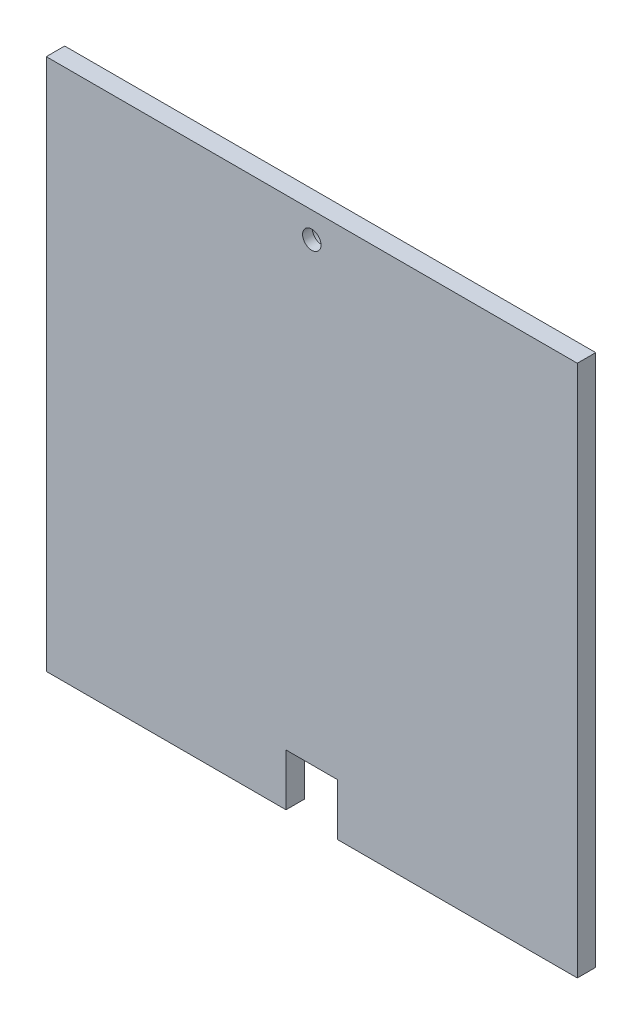
ISO-10303-21;
HEADER;
FILE_DESCRIPTION(('STEP AP214'),'2;1');
FILE_NAME('part.step','',(''),(''),'','','');
FILE_SCHEMA(('AUTOMOTIVE_DESIGN { 1 0 10303 214 1 1 1 1 }'));
ENDSEC;
DATA;
#1=APPLICATION_CONTEXT('core data for automotive mechanical design processes');
#2=APPLICATION_PROTOCOL_DEFINITION('international standard','automotive_design',2000,#1);
#3=PRODUCT_CONTEXT('',#1,'mechanical');
#4=PRODUCT('Part','Part','',(#3));
#5=PRODUCT_RELATED_PRODUCT_CATEGORY('part','',(#4));
#6=PRODUCT_DEFINITION_FORMATION('','',#4);
#7=PRODUCT_DEFINITION_CONTEXT('part definition',#1,'design');
#8=PRODUCT_DEFINITION('design','',#6,#7);
#9=PRODUCT_DEFINITION_SHAPE('','',#8);
#10=(LENGTH_UNIT() NAMED_UNIT(*) SI_UNIT(.MILLI.,.METRE.));
#11=(NAMED_UNIT(*) PLANE_ANGLE_UNIT() SI_UNIT($,.RADIAN.));
#12=(NAMED_UNIT(*) SI_UNIT($,.STERADIAN.) SOLID_ANGLE_UNIT());
#13=UNCERTAINTY_MEASURE_WITH_UNIT(LENGTH_MEASURE(1.E-05),#10,'distance_accuracy_value','');
#14=(GEOMETRIC_REPRESENTATION_CONTEXT(3) GLOBAL_UNCERTAINTY_ASSIGNED_CONTEXT((#13)) GLOBAL_UNIT_ASSIGNED_CONTEXT((#10,
#11,#12)) REPRESENTATION_CONTEXT('',''));
#15=CARTESIAN_POINT('',(0.,0.,0.));
#16=DIRECTION('',(0.,0.,1.));
#17=DIRECTION('',(1.,0.,0.));
#18=AXIS2_PLACEMENT_3D('',#15,#16,#17);
#19=CARTESIAN_POINT('',(-268.431690787297,-820.,15.));
#20=DIRECTION('',(0.,1.,0.));
#21=DIRECTION('',(-1.,0.,0.));
#22=AXIS2_PLACEMENT_3D('',#19,#20,#21);
#23=PLANE('',#22);
#24=DIRECTION('',(1.,0.,0.));
#25=VECTOR('',#24,1.);
#26=CARTESIAN_POINT('',(-268.431690787297,-820.,15.));
#27=LINE('',#26,#25);
#28=CARTESIAN_POINT('',(-31.1990310228092,-820.,15.));
#29=VERTEX_POINT('',#28);
#30=CARTESIAN_POINT('',(164.033628741678,-820.,15.));
#31=VERTEX_POINT('',#30);
#32=EDGE_CURVE('E150',#29,#31,#27,.T.);
#33=ORIENTED_EDGE('',*,*,#32,.F.);
#34=DIRECTION('',(0.,0.,-1.));
#35=VECTOR('',#34,1.);
#36=CARTESIAN_POINT('',(-31.1990310228092,-820.,15.));
#37=LINE('',#36,#35);
#38=CARTESIAN_POINT('',(-31.1990310228092,-820.,0.));
#39=VERTEX_POINT('',#38);
#40=EDGE_CURVE('E11',#29,#39,#37,.T.);
#41=ORIENTED_EDGE('',*,*,#40,.T.);
#42=DIRECTION('',(1.,0.,0.));
#43=VECTOR('',#42,1.);
#44=CARTESIAN_POINT('',(-268.431690787297,-820.,0.));
#45=LINE('',#44,#43);
#46=CARTESIAN_POINT('',(164.033628741678,-820.,0.));
#47=VERTEX_POINT('',#46);
#48=EDGE_CURVE('E145',#39,#47,#45,.T.);
#49=ORIENTED_EDGE('',*,*,#48,.T.);
#50=DIRECTION('',(0.,0.,1.));
#51=VECTOR('',#50,1.);
#52=CARTESIAN_POINT('',(164.033628741678,-820.,15.));
#53=LINE('',#52,#51);
#54=EDGE_CURVE('E140',#47,#31,#53,.T.);
#55=ORIENTED_EDGE('',*,*,#54,.T.);
#56=EDGE_LOOP('',(#33,#41,#49,#55));
#57=FACE_BOUND('',#56,.T.);
#58=ADVANCED_FACE('F37',(#57),#23,.F.);
#59=CARTESIAN_POINT('',(-268.431690787297,0.,15.));
#60=DIRECTION('',(1.,0.,0.));
#61=DIRECTION('',(0.,1.,0.));
#62=AXIS2_PLACEMENT_3D('',#59,#60,#61);
#63=PLANE('',#62);
#64=DIRECTION('',(0.,-1.,0.));
#65=VECTOR('',#64,1.);
#66=CARTESIAN_POINT('',(-268.431690787297,0.,15.));
#67=LINE('',#66,#65);
#68=CARTESIAN_POINT('',(-268.431690787297,-386.429556720008,15.));
#69=VERTEX_POINT('',#68);
#70=CARTESIAN_POINT('',(-268.431690787297,-820.,15.));
#71=VERTEX_POINT('',#70);
#72=EDGE_CURVE('E154',#69,#71,#67,.T.);
#73=ORIENTED_EDGE('',*,*,#72,.F.);
#74=DIRECTION('',(0.,0.,1.));
#75=VECTOR('',#74,1.);
#76=CARTESIAN_POINT('',(-268.431690787297,-386.429556720008,15.));
#77=LINE('',#76,#75);
#78=CARTESIAN_POINT('',(-268.431690787297,-386.429556720008,0.));
#79=VERTEX_POINT('',#78);
#80=EDGE_CURVE('E132',#79,#69,#77,.T.);
#81=ORIENTED_EDGE('',*,*,#80,.F.);
#82=DIRECTION('',(0.,-1.,0.));
#83=VECTOR('',#82,1.);
#84=CARTESIAN_POINT('',(-268.431690787297,0.,0.));
#85=LINE('',#84,#83);
#86=CARTESIAN_POINT('',(-268.431690787297,-820.,0.));
#87=VERTEX_POINT('',#86);
#88=EDGE_CURVE('E149',#79,#87,#85,.T.);
#89=ORIENTED_EDGE('',*,*,#88,.T.);
#90=DIRECTION('',(0.,0.,1.));
#91=VECTOR('',#90,1.);
#92=CARTESIAN_POINT('',(-268.431690787297,-820.,15.));
#93=LINE('',#92,#91);
#94=EDGE_CURVE('E142',#87,#71,#93,.T.);
#95=ORIENTED_EDGE('',*,*,#94,.T.);
#96=EDGE_LOOP('',(#73,#81,#89,#95));
#97=FACE_BOUND('',#96,.T.);
#98=ADVANCED_FACE('F39',(#97),#63,.F.);
#99=CARTESIAN_POINT('',(164.033628741678,0.,15.));
#100=DIRECTION('',(-1.,0.,0.));
#101=DIRECTION('',(0.,-1.,0.));
#102=AXIS2_PLACEMENT_3D('',#99,#100,#101);
#103=PLANE('',#102);
#104=DIRECTION('',(0.,1.,0.));
#105=VECTOR('',#104,1.);
#106=CARTESIAN_POINT('',(164.033628741678,0.,0.));
#107=LINE('',#106,#105);
#108=CARTESIAN_POINT('',(164.033628741678,-386.429556720008,0.));
#109=VERTEX_POINT('',#108);
#110=EDGE_CURVE('E157',#47,#109,#107,.T.);
#111=ORIENTED_EDGE('',*,*,#110,.T.);
#112=DIRECTION('',(0.,0.,1.));
#113=VECTOR('',#112,1.);
#114=CARTESIAN_POINT('',(164.033628741678,-386.429556720008,15.));
#115=LINE('',#114,#113);
#116=CARTESIAN_POINT('',(164.033628741678,-386.429556720008,15.));
#117=VERTEX_POINT('',#116);
#118=EDGE_CURVE('E60',#109,#117,#115,.T.);
#119=ORIENTED_EDGE('',*,*,#118,.T.);
#120=DIRECTION('',(0.,1.,0.));
#121=VECTOR('',#120,1.);
#122=CARTESIAN_POINT('',(164.033628741678,0.,15.));
#123=LINE('',#122,#121);
#124=EDGE_CURVE('E156',#31,#117,#123,.T.);
#125=ORIENTED_EDGE('',*,*,#124,.F.);
#126=ORIENTED_EDGE('',*,*,#54,.F.);
#127=EDGE_LOOP('',(#111,#119,#125,#126));
#128=FACE_BOUND('',#127,.T.);
#129=ADVANCED_FACE('F180',(#128),#103,.F.);
#130=CARTESIAN_POINT('',(0.,0.,15.));
#131=DIRECTION('',(0.,0.,-1.));
#132=DIRECTION('',(-1.,0.,0.));
#133=AXIS2_PLACEMENT_3D('',#130,#131,#132);
#134=PLANE('',#133);
#135=CARTESIAN_POINT('',(-52.1990310228091,-407.429556720008,15.));
#136=DIRECTION('',(0.,0.,-1.));
#137=DIRECTION('',(-1.,0.,0.));
#138=AXIS2_PLACEMENT_3D('',#135,#136,#137);
#139=CIRCLE('',#138,7.5);
#140=CARTESIAN_POINT('',(-59.6990310228091,-407.429556720008,15.));
#141=VERTEX_POINT('',#140);
#142=EDGE_CURVE('E209',#141,#141,#139,.T.);
#143=ORIENTED_EDGE('',*,*,#142,.T.);
#144=EDGE_LOOP('',(#143));
#145=FACE_BOUND('',#144,.T.);
#146=DIRECTION('',(1.,0.,0.));
#147=VECTOR('',#146,1.);
#148=CARTESIAN_POINT('',(-73.1990310228092,-777.772364763387,15.));
#149=LINE('',#148,#147);
#150=CARTESIAN_POINT('',(-73.1990310228092,-777.772364763387,15.));
#151=VERTEX_POINT('',#150);
#152=CARTESIAN_POINT('',(-31.1990310228092,-777.772364763387,15.));
#153=VERTEX_POINT('',#152);
#154=EDGE_CURVE('E109',#151,#153,#149,.T.);
#155=ORIENTED_EDGE('',*,*,#154,.T.);
#156=DIRECTION('',(0.,-1.,0.));
#157=VECTOR('',#156,1.);
#158=CARTESIAN_POINT('',(-31.1990310228092,-820.227635236613,15.));
#159=LINE('',#158,#157);
#160=EDGE_CURVE('E121',#153,#29,#159,.T.);
#161=ORIENTED_EDGE('',*,*,#160,.T.);
#162=ORIENTED_EDGE('',*,*,#32,.T.);
#163=ORIENTED_EDGE('',*,*,#124,.T.);
#164=DIRECTION('',(-1.,0.,0.));
#165=VECTOR('',#164,1.);
#166=CARTESIAN_POINT('',(164.033628741678,-386.429556720008,15.));
#167=LINE('',#166,#165);
#168=EDGE_CURVE('E137',#117,#69,#167,.T.);
#169=ORIENTED_EDGE('',*,*,#168,.T.);
#170=ORIENTED_EDGE('',*,*,#72,.T.);
#171=CARTESIAN_POINT('',(-73.1990310228092,-820.,15.));
#172=VERTEX_POINT('',#171);
#173=EDGE_CURVE('E120',#71,#172,#27,.T.);
#174=ORIENTED_EDGE('',*,*,#173,.T.);
#175=DIRECTION('',(0.,1.,0.));
#176=VECTOR('',#175,1.);
#177=CARTESIAN_POINT('',(-73.1990310228092,-820.227635236613,15.));
#178=LINE('',#177,#176);
#179=EDGE_CURVE('E52',#172,#151,#178,.T.);
#180=ORIENTED_EDGE('',*,*,#179,.T.);
#181=EDGE_LOOP('',(#155,#161,#162,#163,#169,#170,#174,#180));
#182=FACE_BOUND('',#181,.T.);
#183=ADVANCED_FACE('F118',(#145,#182),#134,.F.);
#184=CARTESIAN_POINT('',(0.,0.,0.));
#185=DIRECTION('',(0.,0.,-1.));
#186=DIRECTION('',(-1.,0.,0.));
#187=AXIS2_PLACEMENT_3D('',#184,#185,#186);
#188=PLANE('',#187);
#189=CARTESIAN_POINT('',(-52.1990310228091,-407.429556720008,0.));
#190=DIRECTION('',(0.,0.,-1.));
#191=DIRECTION('',(-1.,0.,0.));
#192=AXIS2_PLACEMENT_3D('',#189,#190,#191);
#193=CIRCLE('',#192,11.);
#194=CARTESIAN_POINT('',(-63.1990310228091,-407.429556720008,0.));
#195=VERTEX_POINT('',#194);
#196=EDGE_CURVE('E207',#195,#195,#193,.T.);
#197=ORIENTED_EDGE('',*,*,#196,.F.);
#198=EDGE_LOOP('',(#197));
#199=FACE_BOUND('',#198,.T.);
#200=DIRECTION('',(0.,-1.,0.));
#201=VECTOR('',#200,1.);
#202=CARTESIAN_POINT('',(-31.1990310228092,-820.227635236613,0.));
#203=LINE('',#202,#201);
#204=CARTESIAN_POINT('',(-31.1990310228092,-777.772364763387,0.));
#205=VERTEX_POINT('',#204);
#206=EDGE_CURVE('E127',#205,#39,#203,.T.);
#207=ORIENTED_EDGE('',*,*,#206,.F.);
#208=DIRECTION('',(1.,0.,0.));
#209=VECTOR('',#208,1.);
#210=CARTESIAN_POINT('',(-73.1990310228092,-777.772364763387,0.));
#211=LINE('',#210,#209);
#212=CARTESIAN_POINT('',(-73.1990310228092,-777.772364763387,0.));
#213=VERTEX_POINT('',#212);
#214=EDGE_CURVE('E123',#213,#205,#211,.T.);
#215=ORIENTED_EDGE('',*,*,#214,.F.);
#216=DIRECTION('',(0.,1.,0.));
#217=VECTOR('',#216,1.);
#218=CARTESIAN_POINT('',(-73.1990310228092,-820.227635236613,0.));
#219=LINE('',#218,#217);
#220=CARTESIAN_POINT('',(-73.1990310228092,-820.,0.));
#221=VERTEX_POINT('',#220);
#222=EDGE_CURVE('E104',#221,#213,#219,.T.);
#223=ORIENTED_EDGE('',*,*,#222,.F.);
#224=EDGE_CURVE('E151',#87,#221,#45,.T.);
#225=ORIENTED_EDGE('',*,*,#224,.F.);
#226=ORIENTED_EDGE('',*,*,#88,.F.);
#227=DIRECTION('',(-1.,0.,0.));
#228=VECTOR('',#227,1.);
#229=CARTESIAN_POINT('',(164.033628741678,-386.429556720008,0.));
#230=LINE('',#229,#228);
#231=EDGE_CURVE('E135',#109,#79,#230,.T.);
#232=ORIENTED_EDGE('',*,*,#231,.F.);
#233=ORIENTED_EDGE('',*,*,#110,.F.);
#234=ORIENTED_EDGE('',*,*,#48,.F.);
#235=EDGE_LOOP('',(#207,#215,#223,#225,#226,#232,#233,#234));
#236=FACE_BOUND('',#235,.T.);
#237=ADVANCED_FACE('F168',(#199,#236),#188,.T.);
#238=ORIENTED_EDGE('',*,*,#224,.T.);
#239=DIRECTION('',(0.,0.,1.));
#240=VECTOR('',#239,1.);
#241=CARTESIAN_POINT('',(-73.1990310228092,-820.,15.));
#242=LINE('',#241,#240);
#243=EDGE_CURVE('E45',#221,#172,#242,.T.);
#244=ORIENTED_EDGE('',*,*,#243,.T.);
#245=ORIENTED_EDGE('',*,*,#173,.F.);
#246=ORIENTED_EDGE('',*,*,#94,.F.);
#247=EDGE_LOOP('',(#238,#244,#245,#246));
#248=FACE_BOUND('',#247,.T.);
#249=ADVANCED_FACE('F163',(#248),#23,.F.);
#250=CARTESIAN_POINT('',(164.033628741678,-386.429556720008,15.));
#251=DIRECTION('',(0.,-1.,0.));
#252=DIRECTION('',(1.,0.,0.));
#253=AXIS2_PLACEMENT_3D('',#250,#251,#252);
#254=PLANE('',#253);
#255=ORIENTED_EDGE('',*,*,#80,.T.);
#256=ORIENTED_EDGE('',*,*,#168,.F.);
#257=ORIENTED_EDGE('',*,*,#118,.F.);
#258=ORIENTED_EDGE('',*,*,#231,.T.);
#259=EDGE_LOOP('',(#255,#256,#257,#258));
#260=FACE_BOUND('',#259,.T.);
#261=ADVANCED_FACE('F182',(#260),#254,.F.);
#262=CARTESIAN_POINT('',(-31.1990310228092,-820.227635236613,15.));
#263=DIRECTION('',(1.,0.,0.));
#264=DIRECTION('',(0.,0.,-1.));
#265=AXIS2_PLACEMENT_3D('',#262,#263,#264);
#266=PLANE('',#265);
#267=ORIENTED_EDGE('',*,*,#160,.F.);
#268=DIRECTION('',(0.,0.,-1.));
#269=VECTOR('',#268,1.);
#270=CARTESIAN_POINT('',(-31.1990310228092,-777.772364763387,15.));
#271=LINE('',#270,#269);
#272=EDGE_CURVE('E108',#153,#205,#271,.T.);
#273=ORIENTED_EDGE('',*,*,#272,.T.);
#274=ORIENTED_EDGE('',*,*,#206,.T.);
#275=ORIENTED_EDGE('',*,*,#40,.F.);
#276=EDGE_LOOP('',(#267,#273,#274,#275));
#277=FACE_BOUND('',#276,.T.);
#278=ADVANCED_FACE('F173',(#277),#266,.F.);
#279=CARTESIAN_POINT('',(-73.1990310228092,-820.227635236613,15.));
#280=DIRECTION('',(-1.,0.,0.));
#281=DIRECTION('',(0.,0.,1.));
#282=AXIS2_PLACEMENT_3D('',#279,#280,#281);
#283=PLANE('',#282);
#284=ORIENTED_EDGE('',*,*,#222,.T.);
#285=DIRECTION('',(0.,0.,-1.));
#286=VECTOR('',#285,1.);
#287=CARTESIAN_POINT('',(-73.1990310228092,-777.772364763387,15.));
#288=LINE('',#287,#286);
#289=EDGE_CURVE('E100',#151,#213,#288,.T.);
#290=ORIENTED_EDGE('',*,*,#289,.F.);
#291=ORIENTED_EDGE('',*,*,#179,.F.);
#292=ORIENTED_EDGE('',*,*,#243,.F.);
#293=EDGE_LOOP('',(#284,#290,#291,#292));
#294=FACE_BOUND('',#293,.T.);
#295=ADVANCED_FACE('F102',(#294),#283,.F.);
#296=CARTESIAN_POINT('',(-73.1990310228092,-777.772364763387,15.));
#297=DIRECTION('',(0.,1.,0.));
#298=DIRECTION('',(0.,0.,1.));
#299=AXIS2_PLACEMENT_3D('',#296,#297,#298);
#300=PLANE('',#299);
#301=ORIENTED_EDGE('',*,*,#214,.T.);
#302=ORIENTED_EDGE('',*,*,#272,.F.);
#303=ORIENTED_EDGE('',*,*,#154,.F.);
#304=ORIENTED_EDGE('',*,*,#289,.T.);
#305=EDGE_LOOP('',(#301,#302,#303,#304));
#306=FACE_BOUND('',#305,.T.);
#307=ADVANCED_FACE('F112',(#306),#300,.F.);
#308=CARTESIAN_POINT('',(-52.1990310228091,-407.429556720008,7.));
#309=DIRECTION('',(0.,0.,-1.));
#310=DIRECTION('',(-1.,0.,0.));
#311=AXIS2_PLACEMENT_3D('',#308,#309,#310);
#312=CYLINDRICAL_SURFACE('',#311,11.);
#313=ORIENTED_EDGE('',*,*,#196,.T.);
#314=EDGE_LOOP('',(#313));
#315=FACE_BOUND('',#314,.T.);
#316=CARTESIAN_POINT('',(-52.1990310228091,-407.429556720008,7.));
#317=DIRECTION('',(0.,0.,-1.));
#318=DIRECTION('',(-1.,0.,0.));
#319=AXIS2_PLACEMENT_3D('',#316,#317,#318);
#320=CIRCLE('',#319,11.);
#321=CARTESIAN_POINT('',(-63.1990310228091,-407.429556720008,7.));
#322=VERTEX_POINT('',#321);
#323=EDGE_CURVE('E129',#322,#322,#320,.T.);
#324=ORIENTED_EDGE('',*,*,#323,.F.);
#325=EDGE_LOOP('',(#324));
#326=FACE_BOUND('',#325,.T.);
#327=ADVANCED_FACE('F224',(#315,#326),#312,.F.);
#328=CARTESIAN_POINT('',(-52.1990310228091,-407.429556720008,7.));
#329=DIRECTION('',(0.,0.,-1.));
#330=DIRECTION('',(-1.,0.,0.));
#331=AXIS2_PLACEMENT_3D('',#328,#329,#330);
#332=PLANE('',#331);
#333=CARTESIAN_POINT('',(-52.1990310228091,-407.429556720008,7.));
#334=DIRECTION('',(0.,0.,-1.));
#335=DIRECTION('',(-1.,0.,0.));
#336=AXIS2_PLACEMENT_3D('',#333,#334,#335);
#337=CIRCLE('',#336,7.5);
#338=CARTESIAN_POINT('',(-59.6990310228091,-407.429556720008,7.));
#339=VERTEX_POINT('',#338);
#340=EDGE_CURVE('E213',#339,#339,#337,.T.);
#341=ORIENTED_EDGE('',*,*,#340,.F.);
#342=EDGE_LOOP('',(#341));
#343=FACE_BOUND('',#342,.T.);
#344=ORIENTED_EDGE('',*,*,#323,.T.);
#345=EDGE_LOOP('',(#344));
#346=FACE_BOUND('',#345,.T.);
#347=ADVANCED_FACE('F221',(#343,#346),#332,.T.);
#348=CARTESIAN_POINT('',(-52.1990310228091,-407.429556720008,15.));
#349=DIRECTION('',(0.,0.,-1.));
#350=DIRECTION('',(-1.,0.,0.));
#351=AXIS2_PLACEMENT_3D('',#348,#349,#350);
#352=CYLINDRICAL_SURFACE('',#351,7.5);
#353=ORIENTED_EDGE('',*,*,#142,.F.);
#354=EDGE_LOOP('',(#353));
#355=FACE_BOUND('',#354,.T.);
#356=ORIENTED_EDGE('',*,*,#340,.T.);
#357=EDGE_LOOP('',(#356));
#358=FACE_BOUND('',#357,.T.);
#359=ADVANCED_FACE('F219',(#355,#358),#352,.F.);
#360=CLOSED_SHELL('',(#58,#98,#129,#183,#237,#249,#261,#278,#295,#307,#327,#347,#359));
#361=MANIFOLD_SOLID_BREP('B2',#360);
#362=ADVANCED_BREP_SHAPE_REPRESENTATION('',(#18,#361),#14);
#363=SHAPE_DEFINITION_REPRESENTATION(#9,#362);
ENDSEC;
END-ISO-10303-21;
